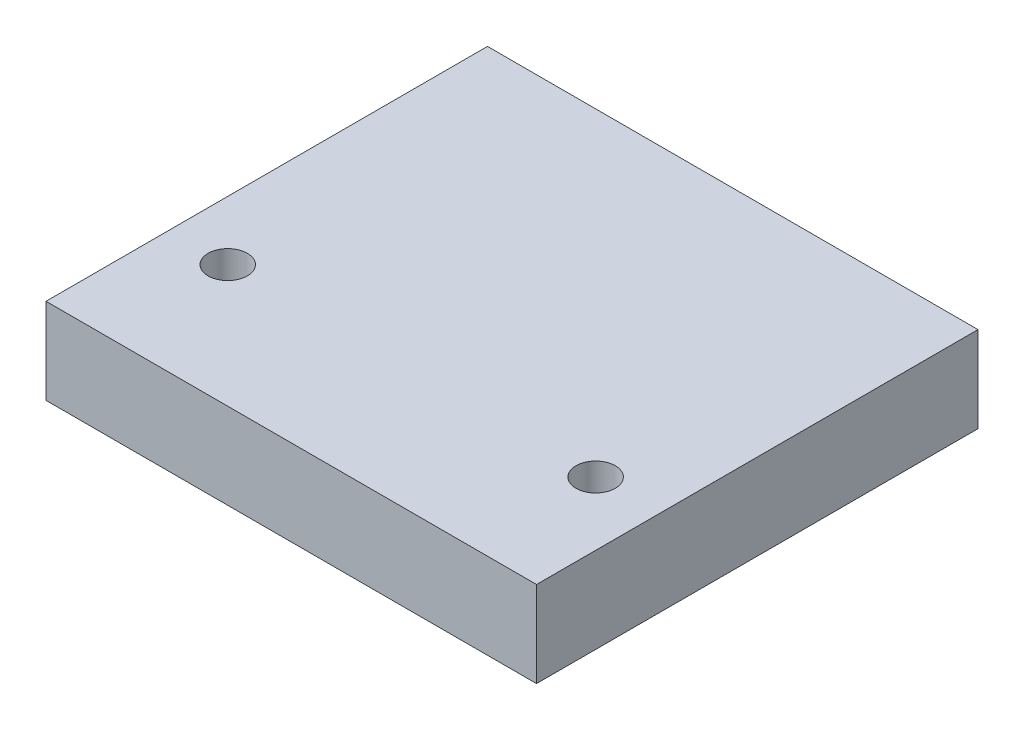
ISO-10303-21;
HEADER;
FILE_DESCRIPTION(('STEP AP214'),'2;1');
FILE_NAME('part.step','',(''),(''),'','','');
FILE_SCHEMA(('AUTOMOTIVE_DESIGN { 1 0 10303 214 1 1 1 1 }'));
ENDSEC;
DATA;
#1=APPLICATION_CONTEXT('core data for automotive mechanical design processes');
#2=APPLICATION_PROTOCOL_DEFINITION('international standard','automotive_design',2000,#1);
#3=PRODUCT_CONTEXT('',#1,'mechanical');
#4=PRODUCT('Part','Part','',(#3));
#5=PRODUCT_RELATED_PRODUCT_CATEGORY('part','',(#4));
#6=PRODUCT_DEFINITION_FORMATION('','',#4);
#7=PRODUCT_DEFINITION_CONTEXT('part definition',#1,'design');
#8=PRODUCT_DEFINITION('design','',#6,#7);
#9=PRODUCT_DEFINITION_SHAPE('','',#8);
#10=(LENGTH_UNIT() NAMED_UNIT(*) SI_UNIT(.MILLI.,.METRE.));
#11=(NAMED_UNIT(*) PLANE_ANGLE_UNIT() SI_UNIT($,.RADIAN.));
#12=(NAMED_UNIT(*) SI_UNIT($,.STERADIAN.) SOLID_ANGLE_UNIT());
#13=UNCERTAINTY_MEASURE_WITH_UNIT(LENGTH_MEASURE(1.E-05),#10,'distance_accuracy_value','');
#14=(GEOMETRIC_REPRESENTATION_CONTEXT(3) GLOBAL_UNCERTAINTY_ASSIGNED_CONTEXT((#13)) GLOBAL_UNIT_ASSIGNED_CONTEXT((#10,
#11,#12)) REPRESENTATION_CONTEXT('',''));
#15=CARTESIAN_POINT('',(0.,0.,0.));
#16=DIRECTION('',(0.,0.,1.));
#17=DIRECTION('',(1.,0.,0.));
#18=AXIS2_PLACEMENT_3D('',#15,#16,#17);
#19=CARTESIAN_POINT('',(-6.96551724137931,0.329939244004113,18.));
#20=DIRECTION('',(1.,0.,0.));
#21=DIRECTION('',(0.,1.,0.));
#22=AXIS2_PLACEMENT_3D('',#19,#20,#21);
#23=PLANE('',#22);
#24=CARTESIAN_POINT('',(-6.96551724137932,-1.42006075599589,8.));
#25=DIRECTION('',(-1.,0.,0.));
#26=DIRECTION('',(0.,0.,1.));
#27=AXIS2_PLACEMENT_3D('',#24,#25,#26);
#28=CIRCLE('',#27,0.62499999999999);
#29=CARTESIAN_POINT('',(-6.96551724137932,-1.42006075599589,8.62499999999999));
#30=VERTEX_POINT('',#29);
#31=EDGE_CURVE('E107',#30,#30,#28,.T.);
#32=ORIENTED_EDGE('',*,*,#31,.F.);
#33=EDGE_LOOP('',(#32));
#34=FACE_BOUND('',#33,.T.);
#35=CARTESIAN_POINT('',(-6.96551724137932,-1.42006075599589,2.));
#36=DIRECTION('',(-1.,0.,0.));
#37=DIRECTION('',(0.,0.,1.));
#38=AXIS2_PLACEMENT_3D('',#35,#36,#37);
#39=CIRCLE('',#38,0.62499999999999);
#40=CARTESIAN_POINT('',(-6.96551724137932,-1.42006075599589,2.62499999999999));
#41=VERTEX_POINT('',#40);
#42=EDGE_CURVE('E106',#41,#41,#39,.T.);
#43=ORIENTED_EDGE('',*,*,#42,.F.);
#44=EDGE_LOOP('',(#43));
#45=FACE_BOUND('',#44,.T.);
#46=DIRECTION('',(0.,-1.,0.));
#47=VECTOR('',#46,1.);
#48=CARTESIAN_POINT('',(-6.96551724137931,0.329939244004113,0.));
#49=LINE('',#48,#47);
#50=CARTESIAN_POINT('',(-6.96551724137931,0.329939244004113,0.));
#51=VERTEX_POINT('',#50);
#52=CARTESIAN_POINT('',(-6.96551724137932,-3.17006075599589,0.));
#53=VERTEX_POINT('',#52);
#54=EDGE_CURVE('E121',#51,#53,#49,.T.);
#55=ORIENTED_EDGE('',*,*,#54,.T.);
#56=DIRECTION('',(0.,0.,-1.));
#57=VECTOR('',#56,1.);
#58=CARTESIAN_POINT('',(-6.96551724137932,-3.17006075599589,18.));
#59=LINE('',#58,#57);
#60=CARTESIAN_POINT('',(-6.96551724137932,-3.17006075599589,18.));
#61=VERTEX_POINT('',#60);
#62=EDGE_CURVE('E11',#61,#53,#59,.T.);
#63=ORIENTED_EDGE('',*,*,#62,.F.);
#64=DIRECTION('',(0.,-1.,0.));
#65=VECTOR('',#64,1.);
#66=CARTESIAN_POINT('',(-6.96551724137931,0.329939244004113,18.));
#67=LINE('',#66,#65);
#68=CARTESIAN_POINT('',(-6.96551724137931,0.329939244004113,18.));
#69=VERTEX_POINT('',#68);
#70=EDGE_CURVE('E130',#69,#61,#67,.T.);
#71=ORIENTED_EDGE('',*,*,#70,.F.);
#72=DIRECTION('',(0.,0.,-1.));
#73=VECTOR('',#72,1.);
#74=CARTESIAN_POINT('',(-6.96551724137931,0.329939244004113,18.));
#75=LINE('',#74,#73);
#76=EDGE_CURVE('E136',#69,#51,#75,.T.);
#77=ORIENTED_EDGE('',*,*,#76,.T.);
#78=EDGE_LOOP('',(#55,#63,#71,#77));
#79=FACE_BOUND('',#78,.T.);
#80=ADVANCED_FACE('F42',(#34,#45,#79),#23,.F.);
#81=CARTESIAN_POINT('',(-6.96551724137932,-3.17006075599589,18.));
#82=DIRECTION('',(0.,1.,0.));
#83=DIRECTION('',(0.,0.,1.));
#84=AXIS2_PLACEMENT_3D('',#81,#82,#83);
#85=PLANE('',#84);
#86=CARTESIAN_POINT('',(-4.55551724137931,-3.17006075599589,13.));
#87=DIRECTION('',(0.,1.,0.));
#88=DIRECTION('',(0.,0.,1.));
#89=AXIS2_PLACEMENT_3D('',#86,#87,#88);
#90=CIRCLE('',#89,0.799999999999999);
#91=CARTESIAN_POINT('',(-4.55551724137931,-3.17006075599589,13.8));
#92=VERTEX_POINT('',#91);
#93=EDGE_CURVE('E118',#92,#92,#90,.T.);
#94=ORIENTED_EDGE('',*,*,#93,.T.);
#95=EDGE_LOOP('',(#94));
#96=FACE_BOUND('',#95,.T.);
#97=CARTESIAN_POINT('',(10.4444827586207,-3.17006075599589,13.));
#98=DIRECTION('',(0.,1.,0.));
#99=DIRECTION('',(0.,0.,1.));
#100=AXIS2_PLACEMENT_3D('',#97,#98,#99);
#101=CIRCLE('',#100,0.799999999999999);
#102=CARTESIAN_POINT('',(10.4444827586207,-3.17006075599589,13.8));
#103=VERTEX_POINT('',#102);
#104=EDGE_CURVE('E117',#103,#103,#101,.T.);
#105=ORIENTED_EDGE('',*,*,#104,.T.);
#106=EDGE_LOOP('',(#105));
#107=FACE_BOUND('',#106,.T.);
#108=DIRECTION('',(1.,0.,0.));
#109=VECTOR('',#108,1.);
#110=CARTESIAN_POINT('',(-6.96551724137932,-3.17006075599589,0.));
#111=LINE('',#110,#109);
#112=CARTESIAN_POINT('',(13.0344827586207,-3.17006075599589,0.));
#113=VERTEX_POINT('',#112);
#114=EDGE_CURVE('E139',#53,#113,#111,.T.);
#115=ORIENTED_EDGE('',*,*,#114,.T.);
#116=DIRECTION('',(0.,0.,-1.));
#117=VECTOR('',#116,1.);
#118=CARTESIAN_POINT('',(13.0344827586207,-3.17006075599589,18.));
#119=LINE('',#118,#117);
#120=CARTESIAN_POINT('',(13.0344827586207,-3.17006075599589,18.));
#121=VERTEX_POINT('',#120);
#122=EDGE_CURVE('E50',#121,#113,#119,.T.);
#123=ORIENTED_EDGE('',*,*,#122,.F.);
#124=DIRECTION('',(1.,0.,0.));
#125=VECTOR('',#124,1.);
#126=CARTESIAN_POINT('',(-6.96551724137932,-3.17006075599589,18.));
#127=LINE('',#126,#125);
#128=EDGE_CURVE('E89',#61,#121,#127,.T.);
#129=ORIENTED_EDGE('',*,*,#128,.F.);
#130=ORIENTED_EDGE('',*,*,#62,.T.);
#131=EDGE_LOOP('',(#115,#123,#129,#130));
#132=FACE_BOUND('',#131,.T.);
#133=ADVANCED_FACE('F163',(#96,#107,#132),#85,.F.);
#134=CARTESIAN_POINT('',(13.0344827586207,0.329939244004113,18.));
#135=DIRECTION('',(-1.,0.,0.));
#136=DIRECTION('',(0.,0.,1.));
#137=AXIS2_PLACEMENT_3D('',#134,#135,#136);
#138=PLANE('',#137);
#139=DIRECTION('',(0.,1.,0.));
#140=VECTOR('',#139,1.);
#141=CARTESIAN_POINT('',(13.0344827586207,0.329939244004113,0.));
#142=LINE('',#141,#140);
#143=CARTESIAN_POINT('',(13.0344827586207,0.329939244004113,0.));
#144=VERTEX_POINT('',#143);
#145=EDGE_CURVE('E76',#113,#144,#142,.T.);
#146=ORIENTED_EDGE('',*,*,#145,.T.);
#147=DIRECTION('',(0.,0.,-1.));
#148=VECTOR('',#147,1.);
#149=CARTESIAN_POINT('',(13.0344827586207,0.329939244004113,18.));
#150=LINE('',#149,#148);
#151=CARTESIAN_POINT('',(13.0344827586207,0.329939244004113,18.));
#152=VERTEX_POINT('',#151);
#153=EDGE_CURVE('E144',#152,#144,#150,.T.);
#154=ORIENTED_EDGE('',*,*,#153,.F.);
#155=DIRECTION('',(0.,1.,0.));
#156=VECTOR('',#155,1.);
#157=CARTESIAN_POINT('',(13.0344827586207,0.329939244004113,18.));
#158=LINE('',#157,#156);
#159=EDGE_CURVE('E133',#121,#152,#158,.T.);
#160=ORIENTED_EDGE('',*,*,#159,.F.);
#161=ORIENTED_EDGE('',*,*,#122,.T.);
#162=EDGE_LOOP('',(#146,#154,#160,#161));
#163=FACE_BOUND('',#162,.T.);
#164=ADVANCED_FACE('F146',(#163),#138,.F.);
#165=CARTESIAN_POINT('',(-6.96551724137931,0.329939244004113,18.));
#166=DIRECTION('',(0.,-1.,0.));
#167=DIRECTION('',(0.,0.,-1.));
#168=AXIS2_PLACEMENT_3D('',#165,#166,#167);
#169=PLANE('',#168);
#170=CARTESIAN_POINT('',(-4.55551724137931,0.329939244004113,13.));
#171=DIRECTION('',(0.,1.,0.));
#172=DIRECTION('',(0.,0.,1.));
#173=AXIS2_PLACEMENT_3D('',#170,#171,#172);
#174=CIRCLE('',#173,0.799999999999999);
#175=CARTESIAN_POINT('',(-4.55551724137931,0.329939244004113,13.8));
#176=VERTEX_POINT('',#175);
#177=EDGE_CURVE('E122',#176,#176,#174,.T.);
#178=ORIENTED_EDGE('',*,*,#177,.F.);
#179=EDGE_LOOP('',(#178));
#180=FACE_BOUND('',#179,.T.);
#181=CARTESIAN_POINT('',(10.4444827586207,0.329939244004113,13.));
#182=DIRECTION('',(0.,1.,0.));
#183=DIRECTION('',(0.,0.,1.));
#184=AXIS2_PLACEMENT_3D('',#181,#182,#183);
#185=CIRCLE('',#184,0.799999999999999);
#186=CARTESIAN_POINT('',(10.4444827586207,0.329939244004113,13.8));
#187=VERTEX_POINT('',#186);
#188=EDGE_CURVE('E125',#187,#187,#185,.T.);
#189=ORIENTED_EDGE('',*,*,#188,.F.);
#190=EDGE_LOOP('',(#189));
#191=FACE_BOUND('',#190,.T.);
#192=DIRECTION('',(-1.,0.,0.));
#193=VECTOR('',#192,1.);
#194=CARTESIAN_POINT('',(-6.96551724137931,0.329939244004113,0.));
#195=LINE('',#194,#193);
#196=EDGE_CURVE('E82',#144,#51,#195,.T.);
#197=ORIENTED_EDGE('',*,*,#196,.T.);
#198=ORIENTED_EDGE('',*,*,#76,.F.);
#199=DIRECTION('',(-1.,0.,0.));
#200=VECTOR('',#199,1.);
#201=CARTESIAN_POINT('',(-6.96551724137931,0.329939244004113,18.));
#202=LINE('',#201,#200);
#203=EDGE_CURVE('E58',#152,#69,#202,.T.);
#204=ORIENTED_EDGE('',*,*,#203,.F.);
#205=ORIENTED_EDGE('',*,*,#153,.T.);
#206=EDGE_LOOP('',(#197,#198,#204,#205));
#207=FACE_BOUND('',#206,.T.);
#208=ADVANCED_FACE('F153',(#180,#191,#207),#169,.F.);
#209=CARTESIAN_POINT('',(0.,0.,18.));
#210=DIRECTION('',(0.,0.,1.));
#211=DIRECTION('',(1.,0.,0.));
#212=AXIS2_PLACEMENT_3D('',#209,#210,#211);
#213=PLANE('',#212);
#214=ORIENTED_EDGE('',*,*,#70,.T.);
#215=ORIENTED_EDGE('',*,*,#128,.T.);
#216=ORIENTED_EDGE('',*,*,#159,.T.);
#217=ORIENTED_EDGE('',*,*,#203,.T.);
#218=EDGE_LOOP('',(#214,#215,#216,#217));
#219=FACE_BOUND('',#218,.T.);
#220=ADVANCED_FACE('F155',(#219),#213,.T.);
#221=CARTESIAN_POINT('',(0.,0.,0.));
#222=DIRECTION('',(0.,0.,1.));
#223=DIRECTION('',(1.,0.,0.));
#224=AXIS2_PLACEMENT_3D('',#221,#222,#223);
#225=PLANE('',#224);
#226=ORIENTED_EDGE('',*,*,#54,.F.);
#227=ORIENTED_EDGE('',*,*,#196,.F.);
#228=ORIENTED_EDGE('',*,*,#145,.F.);
#229=ORIENTED_EDGE('',*,*,#114,.F.);
#230=EDGE_LOOP('',(#226,#227,#228,#229));
#231=FACE_BOUND('',#230,.T.);
#232=ADVANCED_FACE('F149',(#231),#225,.F.);
#233=CARTESIAN_POINT('',(10.4444827586207,-3.17006075599589,13.));
#234=DIRECTION('',(0.,1.,0.));
#235=DIRECTION('',(0.,0.,1.));
#236=AXIS2_PLACEMENT_3D('',#233,#234,#235);
#237=CYLINDRICAL_SURFACE('',#236,0.799999999999999);
#238=ORIENTED_EDGE('',*,*,#104,.F.);
#239=EDGE_LOOP('',(#238));
#240=FACE_BOUND('',#239,.T.);
#241=ORIENTED_EDGE('',*,*,#188,.T.);
#242=EDGE_LOOP('',(#241));
#243=FACE_BOUND('',#242,.T.);
#244=ADVANCED_FACE('F193',(#240,#243),#237,.F.);
#245=CARTESIAN_POINT('',(-4.55551724137931,-3.17006075599589,13.));
#246=DIRECTION('',(0.,1.,0.));
#247=DIRECTION('',(0.,0.,1.));
#248=AXIS2_PLACEMENT_3D('',#245,#246,#247);
#249=CYLINDRICAL_SURFACE('',#248,0.799999999999999);
#250=ORIENTED_EDGE('',*,*,#93,.F.);
#251=EDGE_LOOP('',(#250));
#252=FACE_BOUND('',#251,.T.);
#253=ORIENTED_EDGE('',*,*,#177,.T.);
#254=EDGE_LOOP('',(#253));
#255=FACE_BOUND('',#254,.T.);
#256=ADVANCED_FACE('F185',(#252,#255),#249,.F.);
#257=CARTESIAN_POINT('',(-2.96551724137931,-1.42006075599589,2.));
#258=DIRECTION('',(-1.,0.,0.));
#259=DIRECTION('',(0.,0.,1.));
#260=AXIS2_PLACEMENT_3D('',#257,#258,#259);
#261=CONICAL_SURFACE('',#260,0.624999999999999,1.02974425867665);
#262=CARTESIAN_POINT('',(-2.58997935448709,-1.42006075599589,2.));
#263=VERTEX_POINT('',#262);
#264=VERTEX_LOOP('',#263);
#265=FACE_BOUND('',#264,.T.);
#266=CARTESIAN_POINT('',(-2.96551724137931,-1.42006075599589,2.));
#267=DIRECTION('',(-1.,0.,0.));
#268=DIRECTION('',(0.,0.,1.));
#269=AXIS2_PLACEMENT_3D('',#266,#267,#268);
#270=CIRCLE('',#269,0.624999999999999);
#271=CARTESIAN_POINT('',(-2.96551724137931,-1.42006075599589,2.625));
#272=VERTEX_POINT('',#271);
#273=EDGE_CURVE('E110',#272,#272,#270,.T.);
#274=ORIENTED_EDGE('',*,*,#273,.T.);
#275=EDGE_LOOP('',(#274));
#276=FACE_BOUND('',#275,.T.);
#277=ADVANCED_FACE('F179',(#265,#276),#261,.F.);
#278=CARTESIAN_POINT('',(-6.96551724137931,-1.42006075599589,2.));
#279=DIRECTION('',(-1.,0.,0.));
#280=DIRECTION('',(0.,0.,1.));
#281=AXIS2_PLACEMENT_3D('',#278,#279,#280);
#282=CYLINDRICAL_SURFACE('',#281,0.624999999999994);
#283=ORIENTED_EDGE('',*,*,#273,.F.);
#284=EDGE_LOOP('',(#283));
#285=FACE_BOUND('',#284,.T.);
#286=ORIENTED_EDGE('',*,*,#42,.T.);
#287=EDGE_LOOP('',(#286));
#288=FACE_BOUND('',#287,.T.);
#289=ADVANCED_FACE('F100',(#285,#288),#282,.F.);
#290=CARTESIAN_POINT('',(-2.96551724137931,-1.42006075599589,8.));
#291=DIRECTION('',(-1.,0.,0.));
#292=DIRECTION('',(0.,0.,1.));
#293=AXIS2_PLACEMENT_3D('',#290,#291,#292);
#294=CONICAL_SURFACE('',#293,0.624999999999999,1.02974425867665);
#295=CARTESIAN_POINT('',(-2.58997935448709,-1.42006075599589,8.));
#296=VERTEX_POINT('',#295);
#297=VERTEX_LOOP('',#296);
#298=FACE_BOUND('',#297,.T.);
#299=CARTESIAN_POINT('',(-2.96551724137931,-1.42006075599589,8.));
#300=DIRECTION('',(-1.,0.,0.));
#301=DIRECTION('',(0.,0.,1.));
#302=AXIS2_PLACEMENT_3D('',#299,#300,#301);
#303=CIRCLE('',#302,0.624999999999999);
#304=CARTESIAN_POINT('',(-2.96551724137931,-1.42006075599589,8.625));
#305=VERTEX_POINT('',#304);
#306=EDGE_CURVE('E104',#305,#305,#303,.T.);
#307=ORIENTED_EDGE('',*,*,#306,.T.);
#308=EDGE_LOOP('',(#307));
#309=FACE_BOUND('',#308,.T.);
#310=ADVANCED_FACE('F96',(#298,#309),#294,.F.);
#311=CARTESIAN_POINT('',(-6.96551724137931,-1.42006075599589,8.));
#312=DIRECTION('',(-1.,0.,0.));
#313=DIRECTION('',(0.,0.,1.));
#314=AXIS2_PLACEMENT_3D('',#311,#312,#313);
#315=CYLINDRICAL_SURFACE('',#314,0.624999999999994);
#316=ORIENTED_EDGE('',*,*,#306,.F.);
#317=EDGE_LOOP('',(#316));
#318=FACE_BOUND('',#317,.T.);
#319=ORIENTED_EDGE('',*,*,#31,.T.);
#320=EDGE_LOOP('',(#319));
#321=FACE_BOUND('',#320,.T.);
#322=ADVANCED_FACE('F99',(#318,#321),#315,.F.);
#323=CLOSED_SHELL('',(#80,#133,#164,#208,#220,#232,#244,#256,#277,#289,#310,#322));
#324=MANIFOLD_SOLID_BREP('B2',#323);
#325=ADVANCED_BREP_SHAPE_REPRESENTATION('',(#18,#324),#14);
#326=SHAPE_DEFINITION_REPRESENTATION(#9,#325);
ENDSEC;
END-ISO-10303-21;
